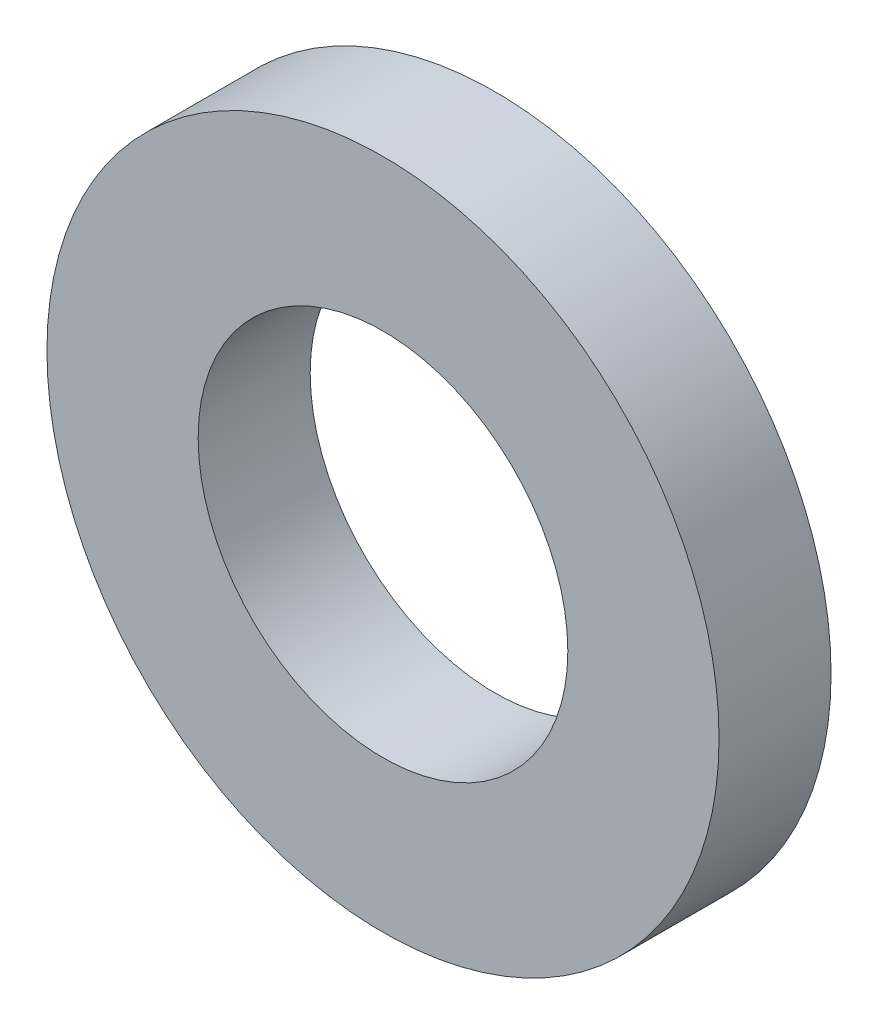
ISO-10303-21;
HEADER;
FILE_DESCRIPTION(('STEP AP214'),'2;1');
FILE_NAME('part.step','',(''),(''),'','','');
FILE_SCHEMA(('AUTOMOTIVE_DESIGN { 1 0 10303 214 1 1 1 1 }'));
ENDSEC;
DATA;
#1=APPLICATION_CONTEXT('core data for automotive mechanical design processes');
#2=APPLICATION_PROTOCOL_DEFINITION('international standard','automotive_design',2000,#1);
#3=PRODUCT_CONTEXT('',#1,'mechanical');
#4=PRODUCT('Part','Part','',(#3));
#5=PRODUCT_RELATED_PRODUCT_CATEGORY('part','',(#4));
#6=PRODUCT_DEFINITION_FORMATION('','',#4);
#7=PRODUCT_DEFINITION_CONTEXT('part definition',#1,'design');
#8=PRODUCT_DEFINITION('design','',#6,#7);
#9=PRODUCT_DEFINITION_SHAPE('','',#8);
#10=(LENGTH_UNIT() NAMED_UNIT(*) SI_UNIT(.MILLI.,.METRE.));
#11=(NAMED_UNIT(*) PLANE_ANGLE_UNIT() SI_UNIT($,.RADIAN.));
#12=(NAMED_UNIT(*) SI_UNIT($,.STERADIAN.) SOLID_ANGLE_UNIT());
#13=UNCERTAINTY_MEASURE_WITH_UNIT(LENGTH_MEASURE(1.E-05),#10,'distance_accuracy_value','');
#14=(GEOMETRIC_REPRESENTATION_CONTEXT(3) GLOBAL_UNCERTAINTY_ASSIGNED_CONTEXT((#13)) GLOBAL_UNIT_ASSIGNED_CONTEXT((#10,
#11,#12)) REPRESENTATION_CONTEXT('',''));
#15=CARTESIAN_POINT('',(0.,0.,0.));
#16=DIRECTION('',(0.,0.,1.));
#17=DIRECTION('',(1.,0.,0.));
#18=AXIS2_PLACEMENT_3D('',#15,#16,#17);
#19=CARTESIAN_POINT('',(0.,0.,1.));
#20=DIRECTION('',(0.,0.,1.));
#21=DIRECTION('',(1.,0.,0.));
#22=AXIS2_PLACEMENT_3D('',#19,#20,#21);
#23=PLANE('',#22);
#24=CARTESIAN_POINT('',(0.,0.,1.));
#25=DIRECTION('',(0.,0.,1.));
#26=DIRECTION('',(1.,0.,0.));
#27=AXIS2_PLACEMENT_3D('',#24,#25,#26);
#28=CIRCLE('',#27,3.);
#29=CARTESIAN_POINT('',(3.,0.,1.));
#30=VERTEX_POINT('',#29);
#31=EDGE_CURVE('E10',#30,#30,#28,.T.);
#32=ORIENTED_EDGE('',*,*,#31,.T.);
#33=EDGE_LOOP('',(#32));
#34=FACE_BOUND('',#33,.T.);
#35=CARTESIAN_POINT('',(0.,0.,1.));
#36=DIRECTION('',(0.,0.,1.));
#37=DIRECTION('',(1.,0.,0.));
#38=AXIS2_PLACEMENT_3D('',#35,#36,#37);
#39=CIRCLE('',#38,1.65);
#40=CARTESIAN_POINT('',(1.65,0.,1.));
#41=VERTEX_POINT('',#40);
#42=EDGE_CURVE('E50',#41,#41,#39,.T.);
#43=ORIENTED_EDGE('',*,*,#42,.F.);
#44=EDGE_LOOP('',(#43));
#45=FACE_BOUND('',#44,.T.);
#46=ADVANCED_FACE('F39',(#34,#45),#23,.T.);
#47=CARTESIAN_POINT('',(0.,0.,0.));
#48=DIRECTION('',(0.,0.,1.));
#49=DIRECTION('',(1.,0.,0.));
#50=AXIS2_PLACEMENT_3D('',#47,#48,#49);
#51=PLANE('',#50);
#52=CARTESIAN_POINT('',(0.,0.,0.));
#53=DIRECTION('',(0.,0.,1.));
#54=DIRECTION('',(1.,0.,0.));
#55=AXIS2_PLACEMENT_3D('',#52,#53,#54);
#56=CIRCLE('',#55,3.);
#57=CARTESIAN_POINT('',(3.,0.,0.));
#58=VERTEX_POINT('',#57);
#59=EDGE_CURVE('E43',#58,#58,#56,.T.);
#60=ORIENTED_EDGE('',*,*,#59,.F.);
#61=EDGE_LOOP('',(#60));
#62=FACE_BOUND('',#61,.T.);
#63=CARTESIAN_POINT('',(0.,0.,0.));
#64=DIRECTION('',(0.,0.,1.));
#65=DIRECTION('',(1.,0.,0.));
#66=AXIS2_PLACEMENT_3D('',#63,#64,#65);
#67=CIRCLE('',#66,1.65);
#68=CARTESIAN_POINT('',(1.65,0.,0.));
#69=VERTEX_POINT('',#68);
#70=EDGE_CURVE('E52',#69,#69,#67,.T.);
#71=ORIENTED_EDGE('',*,*,#70,.T.);
#72=EDGE_LOOP('',(#71));
#73=FACE_BOUND('',#72,.T.);
#74=ADVANCED_FACE('F62',(#62,#73),#51,.F.);
#75=CARTESIAN_POINT('',(0.,0.,1.));
#76=DIRECTION('',(0.,0.,-1.));
#77=DIRECTION('',(-1.,0.,0.));
#78=AXIS2_PLACEMENT_3D('',#75,#76,#77);
#79=CYLINDRICAL_SURFACE('',#78,3.);
#80=ORIENTED_EDGE('',*,*,#31,.F.);
#81=EDGE_LOOP('',(#80));
#82=FACE_BOUND('',#81,.T.);
#83=ORIENTED_EDGE('',*,*,#59,.T.);
#84=EDGE_LOOP('',(#83));
#85=FACE_BOUND('',#84,.T.);
#86=ADVANCED_FACE('F41',(#82,#85),#79,.T.);
#87=CARTESIAN_POINT('',(0.,0.,1.));
#88=DIRECTION('',(0.,0.,-1.));
#89=DIRECTION('',(-1.,0.,0.));
#90=AXIS2_PLACEMENT_3D('',#87,#88,#89);
#91=CYLINDRICAL_SURFACE('',#90,1.65);
#92=ORIENTED_EDGE('',*,*,#42,.T.);
#93=EDGE_LOOP('',(#92));
#94=FACE_BOUND('',#93,.T.);
#95=ORIENTED_EDGE('',*,*,#70,.F.);
#96=EDGE_LOOP('',(#95));
#97=FACE_BOUND('',#96,.T.);
#98=ADVANCED_FACE('F58',(#94,#97),#91,.F.);
#99=CLOSED_SHELL('',(#46,#74,#86,#98));
#100=MANIFOLD_SOLID_BREP('B2',#99);
#101=ADVANCED_BREP_SHAPE_REPRESENTATION('',(#18,#100),#14);
#102=SHAPE_DEFINITION_REPRESENTATION(#9,#101);
ENDSEC;
END-ISO-10303-21;
